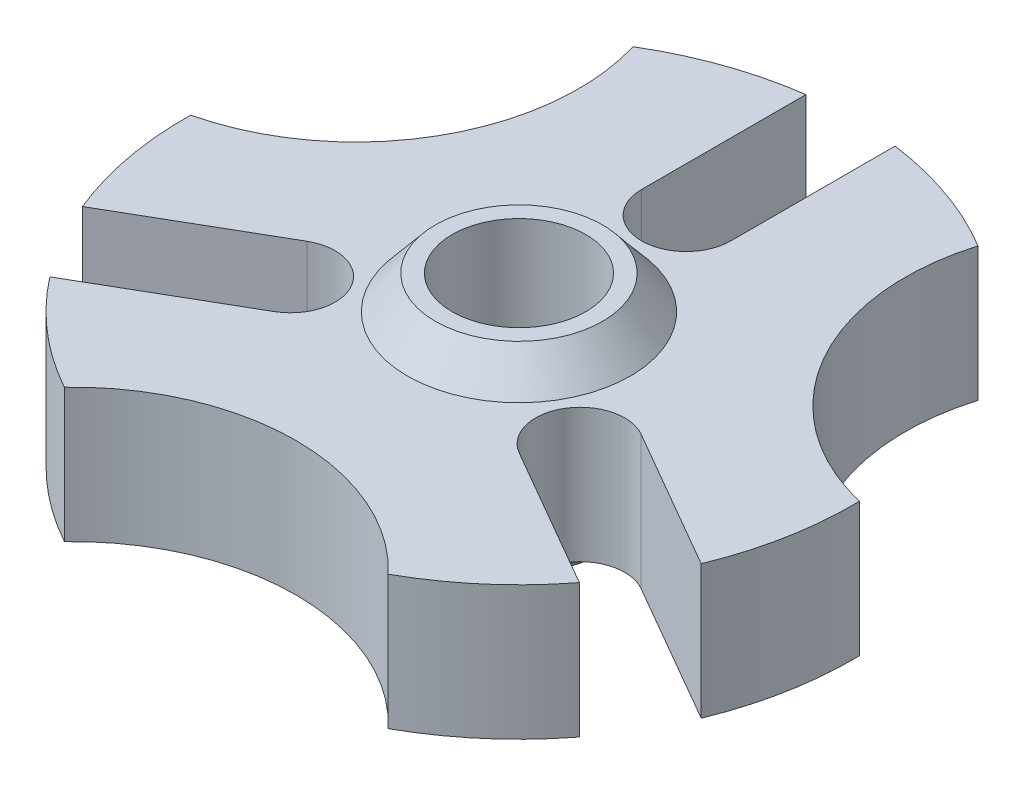
ISO-10303-21;
HEADER;
FILE_DESCRIPTION(('STEP AP214'),'2;1');
FILE_NAME('part.step','',(''),(''),'','','');
FILE_SCHEMA(('AUTOMOTIVE_DESIGN { 1 0 10303 214 1 1 1 1 }'));
ENDSEC;
DATA;
#1=APPLICATION_CONTEXT('core data for automotive mechanical design processes');
#2=APPLICATION_PROTOCOL_DEFINITION('international standard','automotive_design',2000,#1);
#3=PRODUCT_CONTEXT('',#1,'mechanical');
#4=PRODUCT('Part','Part','',(#3));
#5=PRODUCT_RELATED_PRODUCT_CATEGORY('part','',(#4));
#6=PRODUCT_DEFINITION_FORMATION('','',#4);
#7=PRODUCT_DEFINITION_CONTEXT('part definition',#1,'design');
#8=PRODUCT_DEFINITION('design','',#6,#7);
#9=PRODUCT_DEFINITION_SHAPE('','',#8);
#10=(LENGTH_UNIT() NAMED_UNIT(*) SI_UNIT(.MILLI.,.METRE.));
#11=(NAMED_UNIT(*) PLANE_ANGLE_UNIT() SI_UNIT($,.RADIAN.));
#12=(NAMED_UNIT(*) SI_UNIT($,.STERADIAN.) SOLID_ANGLE_UNIT());
#13=UNCERTAINTY_MEASURE_WITH_UNIT(LENGTH_MEASURE(1.E-05),#10,'distance_accuracy_value','');
#14=(GEOMETRIC_REPRESENTATION_CONTEXT(3) GLOBAL_UNCERTAINTY_ASSIGNED_CONTEXT((#13)) GLOBAL_UNIT_ASSIGNED_CONTEXT((#10,
#11,#12)) REPRESENTATION_CONTEXT('',''));
#15=CARTESIAN_POINT('',(0.,0.,0.));
#16=DIRECTION('',(0.,0.,1.));
#17=DIRECTION('',(1.,0.,0.));
#18=AXIS2_PLACEMENT_3D('',#15,#16,#17);
#19=CARTESIAN_POINT('',(0.,6.,0.));
#20=DIRECTION('',(0.,1.,0.));
#21=DIRECTION('',(0.,0.,1.));
#22=AXIS2_PLACEMENT_3D('',#19,#20,#21);
#23=PLANE('',#22);
#24=CARTESIAN_POINT('',(0.,6.,0.));
#25=DIRECTION('',(0.,1.,0.));
#26=DIRECTION('',(0.,0.,1.));
#27=AXIS2_PLACEMENT_3D('',#24,#25,#26);
#28=CIRCLE('',#27,10.);
#29=CARTESIAN_POINT('',(0.,6.,10.));
#30=VERTEX_POINT('',#29);
#31=EDGE_CURVE('E11',#30,#30,#28,.T.);
#32=ORIENTED_EDGE('',*,*,#31,.F.);
#33=EDGE_LOOP('',(#32));
#34=FACE_BOUND('',#33,.T.);
#35=CARTESIAN_POINT('',(0.,6.,0.));
#36=DIRECTION('',(0.,1.,0.));
#37=DIRECTION('',(0.,0.,1.));
#38=AXIS2_PLACEMENT_3D('',#35,#36,#37);
#39=CIRCLE('',#38,30.);
#40=CARTESIAN_POINT('',(-23.7487863791675,6.,18.3301703624562));
#41=VERTEX_POINT('',#40);
#42=CARTESIAN_POINT('',(-14.5236875482778,6.,26.25));
#43=VERTEX_POINT('',#42);
#44=EDGE_CURVE('E254',#41,#43,#39,.T.);
#45=ORIENTED_EDGE('',*,*,#44,.T.);
#46=CARTESIAN_POINT('',(0.,6.,40.));
#47=DIRECTION('',(0.,-1.,0.));
#48=DIRECTION('',(0.,0.,1.));
#49=AXIS2_PLACEMENT_3D('',#46,#47,#48);
#50=CIRCLE('',#49,20.);
#51=CARTESIAN_POINT('',(14.5236875482778,6.,26.25));
#52=VERTEX_POINT('',#51);
#53=EDGE_CURVE('E131',#43,#52,#50,.T.);
#54=ORIENTED_EDGE('',*,*,#53,.T.);
#55=CARTESIAN_POINT('',(0.,6.,0.));
#56=DIRECTION('',(0.,1.,0.));
#57=DIRECTION('',(0.,0.,1.));
#58=AXIS2_PLACEMENT_3D('',#55,#56,#57);
#59=CIRCLE('',#58,30.);
#60=CARTESIAN_POINT('',(23.7487863791671,6.,18.3301703624567));
#61=VERTEX_POINT('',#60);
#62=EDGE_CURVE('E335',#52,#61,#59,.T.);
#63=ORIENTED_EDGE('',*,*,#62,.T.);
#64=DIRECTION('',(-0.866025403784428,0.,-0.500000000000019));
#65=VECTOR('',#64,1.);
#66=CARTESIAN_POINT('',(10.9903810567665,6.,10.9641016151379));
#67=LINE('',#66,#65);
#68=CARTESIAN_POINT('',(10.9903810567665,6.,10.9641016151379));
#69=VERTEX_POINT('',#68);
#70=EDGE_CURVE('E331',#61,#69,#67,.T.);
#71=ORIENTED_EDGE('',*,*,#70,.T.);
#72=CARTESIAN_POINT('',(12.9903810567665,6.,7.50000000000009));
#73=DIRECTION('',(0.,-1.,0.));
#74=DIRECTION('',(0.,0.,1.));
#75=AXIS2_PLACEMENT_3D('',#72,#73,#74);
#76=CIRCLE('',#75,4.);
#77=CARTESIAN_POINT('',(14.9903810567666,6.,4.03589838486237));
#78=VERTEX_POINT('',#77);
#79=EDGE_CURVE('E334',#69,#78,#76,.T.);
#80=ORIENTED_EDGE('',*,*,#79,.T.);
#81=DIRECTION('',(0.866025403784433,0.,0.50000000000001));
#82=VECTOR('',#81,1.);
#83=CARTESIAN_POINT('',(14.9903810567665,6.,4.03589838486241));
#84=LINE('',#83,#82);
#85=CARTESIAN_POINT('',(27.7487863791673,6.,11.4019671321811));
#86=VERTEX_POINT('',#85);
#87=EDGE_CURVE('E339',#78,#86,#84,.T.);
#88=ORIENTED_EDGE('',*,*,#87,.T.);
#89=CARTESIAN_POINT('',(0.,6.,0.));
#90=DIRECTION('',(0.,1.,0.));
#91=DIRECTION('',(0.,0.,1.));
#92=AXIS2_PLACEMENT_3D('',#89,#90,#91);
#93=CIRCLE('',#92,30.);
#94=CARTESIAN_POINT('',(29.9950106234804,6.,-0.547117626563413));
#95=VERTEX_POINT('',#94);
#96=EDGE_CURVE('E346',#86,#95,#93,.T.);
#97=ORIENTED_EDGE('',*,*,#96,.T.);
#98=CARTESIAN_POINT('',(34.6410161513777,6.,-19.9999999999997));
#99=DIRECTION('',(0.,-1.,0.));
#100=DIRECTION('',(0.,0.,1.));
#101=AXIS2_PLACEMENT_3D('',#98,#99,#100);
#102=CIRCLE('',#101,20.);
#103=CARTESIAN_POINT('',(15.4713230752028,6.,-25.7028823734362));
#104=VERTEX_POINT('',#103);
#105=EDGE_CURVE('E349',#95,#104,#102,.T.);
#106=ORIENTED_EDGE('',*,*,#105,.T.);
#107=CARTESIAN_POINT('',(0.,6.,0.));
#108=DIRECTION('',(0.,1.,0.));
#109=DIRECTION('',(0.,0.,1.));
#110=AXIS2_PLACEMENT_3D('',#107,#108,#109);
#111=CIRCLE('',#110,30.);
#112=CARTESIAN_POINT('',(4.0000000000002,6.,-29.732137494637));
#113=VERTEX_POINT('',#112);
#114=EDGE_CURVE('E352',#104,#113,#111,.T.);
#115=ORIENTED_EDGE('',*,*,#114,.T.);
#116=DIRECTION('',(0.,0.,1.));
#117=VECTOR('',#116,1.);
#118=CARTESIAN_POINT('',(4.00000000000011,6.,-15.));
#119=LINE('',#118,#117);
#120=CARTESIAN_POINT('',(4.00000000000011,6.,-15.));
#121=VERTEX_POINT('',#120);
#122=EDGE_CURVE('E355',#113,#121,#119,.T.);
#123=ORIENTED_EDGE('',*,*,#122,.T.);
#124=CARTESIAN_POINT('',(0.,6.,-15.));
#125=DIRECTION('',(0.,-1.,0.));
#126=DIRECTION('',(0.,0.,1.));
#127=AXIS2_PLACEMENT_3D('',#124,#125,#126);
#128=CIRCLE('',#127,4.);
#129=CARTESIAN_POINT('',(-3.99999999999993,6.,-15.));
#130=VERTEX_POINT('',#129);
#131=EDGE_CURVE('E358',#121,#130,#128,.T.);
#132=ORIENTED_EDGE('',*,*,#131,.T.);
#133=DIRECTION('',(0.,0.,-1.));
#134=VECTOR('',#133,1.);
#135=CARTESIAN_POINT('',(-3.9999999999999,6.,-15.));
#136=LINE('',#135,#134);
#137=CARTESIAN_POINT('',(-3.9999999999998,6.,-29.732137494637));
#138=VERTEX_POINT('',#137);
#139=EDGE_CURVE('E361',#130,#138,#136,.T.);
#140=ORIENTED_EDGE('',*,*,#139,.T.);
#141=CARTESIAN_POINT('',(0.,6.,0.));
#142=DIRECTION('',(0.,1.,0.));
#143=DIRECTION('',(0.,0.,1.));
#144=AXIS2_PLACEMENT_3D('',#141,#142,#143);
#145=CIRCLE('',#144,30.);
#146=CARTESIAN_POINT('',(-15.4713230752025,6.,-25.7028823734364));
#147=VERTEX_POINT('',#146);
#148=EDGE_CURVE('E364',#138,#147,#145,.T.);
#149=ORIENTED_EDGE('',*,*,#148,.T.);
#150=CARTESIAN_POINT('',(-34.6410161513775,6.,-20.0000000000002));
#151=DIRECTION('',(0.,-1.,0.));
#152=DIRECTION('',(0.,0.,1.));
#153=AXIS2_PLACEMENT_3D('',#150,#151,#152);
#154=CIRCLE('',#153,20.);
#155=CARTESIAN_POINT('',(-29.9950106234804,6.,-0.547117626563808));
#156=VERTEX_POINT('',#155);
#157=EDGE_CURVE('E367',#147,#156,#154,.T.);
#158=ORIENTED_EDGE('',*,*,#157,.T.);
#159=CARTESIAN_POINT('',(0.,6.,0.));
#160=DIRECTION('',(0.,1.,0.));
#161=DIRECTION('',(0.,0.,1.));
#162=AXIS2_PLACEMENT_3D('',#159,#160,#161);
#163=CIRCLE('',#162,30.);
#164=CARTESIAN_POINT('',(-27.7487863791676,6.,11.4019671321806));
#165=VERTEX_POINT('',#164);
#166=EDGE_CURVE('E179',#156,#165,#163,.T.);
#167=ORIENTED_EDGE('',*,*,#166,.T.);
#168=DIRECTION('',(0.866025403784445,0.,-0.49999999999999));
#169=VECTOR('',#168,1.);
#170=CARTESIAN_POINT('',(-14.9903810567666,6.,4.03589838486221));
#171=LINE('',#170,#169);
#172=CARTESIAN_POINT('',(-14.9903810567666,6.,4.03589838486221));
#173=VERTEX_POINT('',#172);
#174=EDGE_CURVE('E174',#165,#173,#171,.T.);
#175=ORIENTED_EDGE('',*,*,#174,.T.);
#176=CARTESIAN_POINT('',(-12.9903810567667,6.,7.49999999999992));
#177=DIRECTION('',(0.,-1.,0.));
#178=DIRECTION('',(0.,0.,1.));
#179=AXIS2_PLACEMENT_3D('',#176,#177,#178);
#180=CIRCLE('',#179,4.);
#181=CARTESIAN_POINT('',(-10.9903810567666,6.,10.9641016151377));
#182=VERTEX_POINT('',#181);
#183=EDGE_CURVE('E177',#173,#182,#180,.T.);
#184=ORIENTED_EDGE('',*,*,#183,.T.);
#185=DIRECTION('',(-0.86602540378444,0.,0.499999999999998));
#186=VECTOR('',#185,1.);
#187=CARTESIAN_POINT('',(-10.9903810567666,6.,10.9641016151377));
#188=LINE('',#187,#186);
#189=EDGE_CURVE('E57',#182,#41,#188,.T.);
#190=ORIENTED_EDGE('',*,*,#189,.T.);
#191=EDGE_LOOP('',(#45,#54,#63,#71,#80,#88,#97,#106,#115,#123,#132,#140,#149,#158,#167,#175,
#184,#190));
#192=FACE_BOUND('',#191,.T.);
#193=ADVANCED_FACE('F39',(#34,#192),#23,.T.);
#194=CARTESIAN_POINT('',(0.,-6.,0.));
#195=DIRECTION('',(0.,1.,0.));
#196=DIRECTION('',(0.,0.,1.));
#197=AXIS2_PLACEMENT_3D('',#194,#195,#196);
#198=PLANE('',#197);
#199=CARTESIAN_POINT('',(0.,-6.,0.));
#200=DIRECTION('',(0.,1.,0.));
#201=DIRECTION('',(0.,0.,1.));
#202=AXIS2_PLACEMENT_3D('',#199,#200,#201);
#203=CIRCLE('',#202,10.);
#204=CARTESIAN_POINT('',(0.,-6.,10.));
#205=VERTEX_POINT('',#204);
#206=EDGE_CURVE('E650',#205,#205,#203,.T.);
#207=ORIENTED_EDGE('',*,*,#206,.T.);
#208=EDGE_LOOP('',(#207));
#209=FACE_BOUND('',#208,.T.);
#210=CARTESIAN_POINT('',(0.,-6.,0.));
#211=DIRECTION('',(0.,1.,0.));
#212=DIRECTION('',(0.,0.,1.));
#213=AXIS2_PLACEMENT_3D('',#210,#211,#212);
#214=CIRCLE('',#213,30.);
#215=CARTESIAN_POINT('',(-23.7487863791675,-6.,18.3301703624562));
#216=VERTEX_POINT('',#215);
#217=CARTESIAN_POINT('',(-14.5236875482778,-6.,26.25));
#218=VERTEX_POINT('',#217);
#219=EDGE_CURVE('E201',#216,#218,#214,.T.);
#220=ORIENTED_EDGE('',*,*,#219,.F.);
#221=DIRECTION('',(-0.86602540378444,0.,0.499999999999998));
#222=VECTOR('',#221,1.);
#223=CARTESIAN_POINT('',(-10.9903810567666,-6.,10.9641016151377));
#224=LINE('',#223,#222);
#225=CARTESIAN_POINT('',(-10.9903810567666,-6.,10.9641016151377));
#226=VERTEX_POINT('',#225);
#227=EDGE_CURVE('E122',#226,#216,#224,.T.);
#228=ORIENTED_EDGE('',*,*,#227,.F.);
#229=CARTESIAN_POINT('',(-12.9903810567667,-6.,7.49999999999992));
#230=DIRECTION('',(0.,-1.,0.));
#231=DIRECTION('',(0.,0.,1.));
#232=AXIS2_PLACEMENT_3D('',#229,#230,#231);
#233=CIRCLE('',#232,4.);
#234=CARTESIAN_POINT('',(-14.9903810567666,-6.,4.03589838486221));
#235=VERTEX_POINT('',#234);
#236=EDGE_CURVE('E116',#235,#226,#233,.T.);
#237=ORIENTED_EDGE('',*,*,#236,.F.);
#238=DIRECTION('',(0.866025403784445,0.,-0.49999999999999));
#239=VECTOR('',#238,1.);
#240=CARTESIAN_POINT('',(-14.9903810567666,-6.,4.03589838486221));
#241=LINE('',#240,#239);
#242=CARTESIAN_POINT('',(-27.7487863791676,-6.,11.4019671321806));
#243=VERTEX_POINT('',#242);
#244=EDGE_CURVE('E188',#243,#235,#241,.T.);
#245=ORIENTED_EDGE('',*,*,#244,.F.);
#246=CARTESIAN_POINT('',(0.,-6.,0.));
#247=DIRECTION('',(0.,1.,0.));
#248=DIRECTION('',(0.,0.,1.));
#249=AXIS2_PLACEMENT_3D('',#246,#247,#248);
#250=CIRCLE('',#249,30.);
#251=CARTESIAN_POINT('',(-29.9950106234804,-6.,-0.547117626563808));
#252=VERTEX_POINT('',#251);
#253=EDGE_CURVE('E245',#252,#243,#250,.T.);
#254=ORIENTED_EDGE('',*,*,#253,.F.);
#255=CARTESIAN_POINT('',(-34.6410161513775,-6.,-20.0000000000002));
#256=DIRECTION('',(0.,-1.,0.));
#257=DIRECTION('',(0.,0.,1.));
#258=AXIS2_PLACEMENT_3D('',#255,#256,#257);
#259=CIRCLE('',#258,20.);
#260=CARTESIAN_POINT('',(-15.4713230752025,-6.,-25.7028823734364));
#261=VERTEX_POINT('',#260);
#262=EDGE_CURVE('E242',#261,#252,#259,.T.);
#263=ORIENTED_EDGE('',*,*,#262,.F.);
#264=CARTESIAN_POINT('',(0.,-6.,0.));
#265=DIRECTION('',(0.,1.,0.));
#266=DIRECTION('',(0.,0.,1.));
#267=AXIS2_PLACEMENT_3D('',#264,#265,#266);
#268=CIRCLE('',#267,30.);
#269=CARTESIAN_POINT('',(-3.9999999999998,-6.,-29.732137494637));
#270=VERTEX_POINT('',#269);
#271=EDGE_CURVE('E239',#270,#261,#268,.T.);
#272=ORIENTED_EDGE('',*,*,#271,.F.);
#273=DIRECTION('',(0.,0.,-1.));
#274=VECTOR('',#273,1.);
#275=CARTESIAN_POINT('',(-3.9999999999999,-6.,-15.));
#276=LINE('',#275,#274);
#277=CARTESIAN_POINT('',(-3.99999999999993,-6.,-15.));
#278=VERTEX_POINT('',#277);
#279=EDGE_CURVE('E236',#278,#270,#276,.T.);
#280=ORIENTED_EDGE('',*,*,#279,.F.);
#281=CARTESIAN_POINT('',(0.,-6.,-15.));
#282=DIRECTION('',(0.,-1.,0.));
#283=DIRECTION('',(0.,0.,1.));
#284=AXIS2_PLACEMENT_3D('',#281,#282,#283);
#285=CIRCLE('',#284,4.);
#286=CARTESIAN_POINT('',(4.00000000000011,-6.,-15.));
#287=VERTEX_POINT('',#286);
#288=EDGE_CURVE('E233',#287,#278,#285,.T.);
#289=ORIENTED_EDGE('',*,*,#288,.F.);
#290=DIRECTION('',(0.,0.,1.));
#291=VECTOR('',#290,1.);
#292=CARTESIAN_POINT('',(4.00000000000011,-6.,-15.));
#293=LINE('',#292,#291);
#294=CARTESIAN_POINT('',(4.0000000000002,-6.,-29.732137494637));
#295=VERTEX_POINT('',#294);
#296=EDGE_CURVE('E230',#295,#287,#293,.T.);
#297=ORIENTED_EDGE('',*,*,#296,.F.);
#298=CARTESIAN_POINT('',(0.,-6.,0.));
#299=DIRECTION('',(0.,1.,0.));
#300=DIRECTION('',(0.,0.,1.));
#301=AXIS2_PLACEMENT_3D('',#298,#299,#300);
#302=CIRCLE('',#301,30.);
#303=CARTESIAN_POINT('',(15.4713230752028,-6.,-25.7028823734362));
#304=VERTEX_POINT('',#303);
#305=EDGE_CURVE('E227',#304,#295,#302,.T.);
#306=ORIENTED_EDGE('',*,*,#305,.F.);
#307=CARTESIAN_POINT('',(34.6410161513777,-6.,-19.9999999999997));
#308=DIRECTION('',(0.,-1.,0.));
#309=DIRECTION('',(0.,0.,1.));
#310=AXIS2_PLACEMENT_3D('',#307,#308,#309);
#311=CIRCLE('',#310,20.);
#312=CARTESIAN_POINT('',(29.9950106234804,-6.,-0.547117626563413));
#313=VERTEX_POINT('',#312);
#314=EDGE_CURVE('E224',#313,#304,#311,.T.);
#315=ORIENTED_EDGE('',*,*,#314,.F.);
#316=CARTESIAN_POINT('',(0.,-6.,0.));
#317=DIRECTION('',(0.,1.,0.));
#318=DIRECTION('',(0.,0.,1.));
#319=AXIS2_PLACEMENT_3D('',#316,#317,#318);
#320=CIRCLE('',#319,30.);
#321=CARTESIAN_POINT('',(27.7487863791673,-6.,11.4019671321811));
#322=VERTEX_POINT('',#321);
#323=EDGE_CURVE('E221',#322,#313,#320,.T.);
#324=ORIENTED_EDGE('',*,*,#323,.F.);
#325=DIRECTION('',(0.866025403784433,0.,0.50000000000001));
#326=VECTOR('',#325,1.);
#327=CARTESIAN_POINT('',(14.9903810567665,-6.,4.03589838486241));
#328=LINE('',#327,#326);
#329=CARTESIAN_POINT('',(14.9903810567666,-6.,4.03589838486237));
#330=VERTEX_POINT('',#329);
#331=EDGE_CURVE('E218',#330,#322,#328,.T.);
#332=ORIENTED_EDGE('',*,*,#331,.F.);
#333=CARTESIAN_POINT('',(12.9903810567665,-6.,7.50000000000009));
#334=DIRECTION('',(0.,-1.,0.));
#335=DIRECTION('',(0.,0.,1.));
#336=AXIS2_PLACEMENT_3D('',#333,#334,#335);
#337=CIRCLE('',#336,4.);
#338=CARTESIAN_POINT('',(10.9903810567665,-6.,10.9641016151379));
#339=VERTEX_POINT('',#338);
#340=EDGE_CURVE('E215',#339,#330,#337,.T.);
#341=ORIENTED_EDGE('',*,*,#340,.F.);
#342=DIRECTION('',(-0.866025403784428,0.,-0.500000000000019));
#343=VECTOR('',#342,1.);
#344=CARTESIAN_POINT('',(10.9903810567665,-6.,10.9641016151379));
#345=LINE('',#344,#343);
#346=CARTESIAN_POINT('',(23.7487863791671,-6.,18.3301703624567));
#347=VERTEX_POINT('',#346);
#348=EDGE_CURVE('E212',#347,#339,#345,.T.);
#349=ORIENTED_EDGE('',*,*,#348,.F.);
#350=CARTESIAN_POINT('',(0.,-6.,0.));
#351=DIRECTION('',(0.,1.,0.));
#352=DIRECTION('',(0.,0.,1.));
#353=AXIS2_PLACEMENT_3D('',#350,#351,#352);
#354=CIRCLE('',#353,30.);
#355=CARTESIAN_POINT('',(14.5236875482778,-6.,26.25));
#356=VERTEX_POINT('',#355);
#357=EDGE_CURVE('E209',#356,#347,#354,.T.);
#358=ORIENTED_EDGE('',*,*,#357,.F.);
#359=CARTESIAN_POINT('',(0.,-6.,40.));
#360=DIRECTION('',(0.,-1.,0.));
#361=DIRECTION('',(0.,0.,1.));
#362=AXIS2_PLACEMENT_3D('',#359,#360,#361);
#363=CIRCLE('',#362,20.);
#364=EDGE_CURVE('E205',#218,#356,#363,.T.);
#365=ORIENTED_EDGE('',*,*,#364,.F.);
#366=EDGE_LOOP('',(#220,#228,#237,#245,#254,#263,#272,#280,#289,#297,#306,#315,#324,#332,#341,
#349,#358,#365));
#367=FACE_BOUND('',#366,.T.);
#368=ADVANCED_FACE('F319',(#209,#367),#198,.F.);
#369=CARTESIAN_POINT('',(0.,6.,0.));
#370=DIRECTION('',(0.,-1.,0.));
#371=DIRECTION('',(0.,0.,-1.));
#372=AXIS2_PLACEMENT_3D('',#369,#370,#371);
#373=CYLINDRICAL_SURFACE('',#372,30.);
#374=ORIENTED_EDGE('',*,*,#219,.T.);
#375=DIRECTION('',(0.,-1.,0.));
#376=VECTOR('',#375,1.);
#377=CARTESIAN_POINT('',(-14.5236875482778,6.,26.25));
#378=LINE('',#377,#376);
#379=EDGE_CURVE('E49',#43,#218,#378,.T.);
#380=ORIENTED_EDGE('',*,*,#379,.F.);
#381=ORIENTED_EDGE('',*,*,#44,.F.);
#382=DIRECTION('',(0.,-1.,0.));
#383=VECTOR('',#382,1.);
#384=CARTESIAN_POINT('',(-23.7487863791675,6.,18.3301703624562));
#385=LINE('',#384,#383);
#386=EDGE_CURVE('E197',#41,#216,#385,.T.);
#387=ORIENTED_EDGE('',*,*,#386,.T.);
#388=EDGE_LOOP('',(#374,#380,#381,#387));
#389=FACE_BOUND('',#388,.T.);
#390=ADVANCED_FACE('F41',(#389),#373,.T.);
#391=CARTESIAN_POINT('',(0.,6.,40.));
#392=DIRECTION('',(0.,-1.,0.));
#393=DIRECTION('',(0.,0.,-1.));
#394=AXIS2_PLACEMENT_3D('',#391,#392,#393);
#395=CYLINDRICAL_SURFACE('',#394,20.);
#396=ORIENTED_EDGE('',*,*,#364,.T.);
#397=DIRECTION('',(0.,-1.,0.));
#398=VECTOR('',#397,1.);
#399=CARTESIAN_POINT('',(14.5236875482778,6.,26.25));
#400=LINE('',#399,#398);
#401=EDGE_CURVE('E309',#52,#356,#400,.T.);
#402=ORIENTED_EDGE('',*,*,#401,.F.);
#403=ORIENTED_EDGE('',*,*,#53,.F.);
#404=ORIENTED_EDGE('',*,*,#379,.T.);
#405=EDGE_LOOP('',(#396,#402,#403,#404));
#406=FACE_BOUND('',#405,.T.);
#407=ADVANCED_FACE('F314',(#406),#395,.F.);
#408=CARTESIAN_POINT('',(0.,6.,0.));
#409=DIRECTION('',(0.,-1.,0.));
#410=DIRECTION('',(0.,0.,-1.));
#411=AXIS2_PLACEMENT_3D('',#408,#409,#410);
#412=CYLINDRICAL_SURFACE('',#411,30.);
#413=ORIENTED_EDGE('',*,*,#357,.T.);
#414=DIRECTION('',(0.,-1.,0.));
#415=VECTOR('',#414,1.);
#416=CARTESIAN_POINT('',(23.7487863791671,6.,18.3301703624567));
#417=LINE('',#416,#415);
#418=EDGE_CURVE('E305',#61,#347,#417,.T.);
#419=ORIENTED_EDGE('',*,*,#418,.F.);
#420=ORIENTED_EDGE('',*,*,#62,.F.);
#421=ORIENTED_EDGE('',*,*,#401,.T.);
#422=EDGE_LOOP('',(#413,#419,#420,#421));
#423=FACE_BOUND('',#422,.T.);
#424=ADVANCED_FACE('F325',(#423),#412,.T.);
#425=CARTESIAN_POINT('',(10.9903810567665,6.,10.9641016151379));
#426=DIRECTION('',(-0.500000000000019,0.,0.866025403784428));
#427=DIRECTION('',(0.866025403784428,0.,0.500000000000019));
#428=AXIS2_PLACEMENT_3D('',#425,#426,#427);
#429=PLANE('',#428);
#430=ORIENTED_EDGE('',*,*,#348,.T.);
#431=DIRECTION('',(0.,-1.,0.));
#432=VECTOR('',#431,1.);
#433=CARTESIAN_POINT('',(10.9903810567665,6.,10.9641016151379));
#434=LINE('',#433,#432);
#435=EDGE_CURVE('E301',#69,#339,#434,.T.);
#436=ORIENTED_EDGE('',*,*,#435,.F.);
#437=ORIENTED_EDGE('',*,*,#70,.F.);
#438=ORIENTED_EDGE('',*,*,#418,.T.);
#439=EDGE_LOOP('',(#430,#436,#437,#438));
#440=FACE_BOUND('',#439,.T.);
#441=ADVANCED_FACE('F329',(#440),#429,.F.);
#442=CARTESIAN_POINT('',(12.9903810567665,6.,7.50000000000009));
#443=DIRECTION('',(0.,-1.,0.));
#444=DIRECTION('',(0.,0.,-1.));
#445=AXIS2_PLACEMENT_3D('',#442,#443,#444);
#446=CYLINDRICAL_SURFACE('',#445,4.);
#447=ORIENTED_EDGE('',*,*,#340,.T.);
#448=DIRECTION('',(0.,-1.,0.));
#449=VECTOR('',#448,1.);
#450=CARTESIAN_POINT('',(14.9903810567666,6.,4.03589838486237));
#451=LINE('',#450,#449);
#452=EDGE_CURVE('E297',#78,#330,#451,.T.);
#453=ORIENTED_EDGE('',*,*,#452,.F.);
#454=ORIENTED_EDGE('',*,*,#79,.F.);
#455=ORIENTED_EDGE('',*,*,#435,.T.);
#456=EDGE_LOOP('',(#447,#453,#454,#455));
#457=FACE_BOUND('',#456,.T.);
#458=ADVANCED_FACE('F420',(#457),#446,.F.);
#459=CARTESIAN_POINT('',(14.9903810567665,6.,4.03589838486241));
#460=DIRECTION('',(0.50000000000001,0.,-0.866025403784433));
#461=DIRECTION('',(-0.866025403784433,0.,-0.50000000000001));
#462=AXIS2_PLACEMENT_3D('',#459,#460,#461);
#463=PLANE('',#462);
#464=ORIENTED_EDGE('',*,*,#331,.T.);
#465=DIRECTION('',(0.,-1.,0.));
#466=VECTOR('',#465,1.);
#467=CARTESIAN_POINT('',(27.7487863791673,6.,11.4019671321811));
#468=LINE('',#467,#466);
#469=EDGE_CURVE('E293',#86,#322,#468,.T.);
#470=ORIENTED_EDGE('',*,*,#469,.F.);
#471=ORIENTED_EDGE('',*,*,#87,.F.);
#472=ORIENTED_EDGE('',*,*,#452,.T.);
#473=EDGE_LOOP('',(#464,#470,#471,#472));
#474=FACE_BOUND('',#473,.T.);
#475=ADVANCED_FACE('F417',(#474),#463,.F.);
#476=CARTESIAN_POINT('',(0.,6.,0.));
#477=DIRECTION('',(0.,-1.,0.));
#478=DIRECTION('',(0.,0.,-1.));
#479=AXIS2_PLACEMENT_3D('',#476,#477,#478);
#480=CYLINDRICAL_SURFACE('',#479,30.);
#481=ORIENTED_EDGE('',*,*,#323,.T.);
#482=DIRECTION('',(0.,-1.,0.));
#483=VECTOR('',#482,1.);
#484=CARTESIAN_POINT('',(29.9950106234804,6.,-0.547117626563413));
#485=LINE('',#484,#483);
#486=EDGE_CURVE('E289',#95,#313,#485,.T.);
#487=ORIENTED_EDGE('',*,*,#486,.F.);
#488=ORIENTED_EDGE('',*,*,#96,.F.);
#489=ORIENTED_EDGE('',*,*,#469,.T.);
#490=EDGE_LOOP('',(#481,#487,#488,#489));
#491=FACE_BOUND('',#490,.T.);
#492=ADVANCED_FACE('F412',(#491),#480,.T.);
#493=CARTESIAN_POINT('',(34.6410161513777,6.,-19.9999999999997));
#494=DIRECTION('',(0.,-1.,0.));
#495=DIRECTION('',(0.,0.,-1.));
#496=AXIS2_PLACEMENT_3D('',#493,#494,#495);
#497=CYLINDRICAL_SURFACE('',#496,20.);
#498=ORIENTED_EDGE('',*,*,#314,.T.);
#499=DIRECTION('',(0.,-1.,0.));
#500=VECTOR('',#499,1.);
#501=CARTESIAN_POINT('',(15.4713230752028,6.,-25.7028823734362));
#502=LINE('',#501,#500);
#503=EDGE_CURVE('E285',#104,#304,#502,.T.);
#504=ORIENTED_EDGE('',*,*,#503,.F.);
#505=ORIENTED_EDGE('',*,*,#105,.F.);
#506=ORIENTED_EDGE('',*,*,#486,.T.);
#507=EDGE_LOOP('',(#498,#504,#505,#506));
#508=FACE_BOUND('',#507,.T.);
#509=ADVANCED_FACE('F407',(#508),#497,.F.);
#510=CARTESIAN_POINT('',(0.,6.,0.));
#511=DIRECTION('',(0.,-1.,0.));
#512=DIRECTION('',(0.,0.,-1.));
#513=AXIS2_PLACEMENT_3D('',#510,#511,#512);
#514=CYLINDRICAL_SURFACE('',#513,30.);
#515=ORIENTED_EDGE('',*,*,#305,.T.);
#516=DIRECTION('',(0.,-1.,0.));
#517=VECTOR('',#516,1.);
#518=CARTESIAN_POINT('',(4.0000000000002,6.,-29.732137494637));
#519=LINE('',#518,#517);
#520=EDGE_CURVE('E281',#113,#295,#519,.T.);
#521=ORIENTED_EDGE('',*,*,#520,.F.);
#522=ORIENTED_EDGE('',*,*,#114,.F.);
#523=ORIENTED_EDGE('',*,*,#503,.T.);
#524=EDGE_LOOP('',(#515,#521,#522,#523));
#525=FACE_BOUND('',#524,.T.);
#526=ADVANCED_FACE('F403',(#525),#514,.T.);
#527=CARTESIAN_POINT('',(4.00000000000011,6.,-15.));
#528=DIRECTION('',(1.,0.,0.));
#529=DIRECTION('',(0.,0.,-1.));
#530=AXIS2_PLACEMENT_3D('',#527,#528,#529);
#531=PLANE('',#530);
#532=ORIENTED_EDGE('',*,*,#296,.T.);
#533=DIRECTION('',(0.,-1.,0.));
#534=VECTOR('',#533,1.);
#535=CARTESIAN_POINT('',(4.00000000000011,6.,-15.));
#536=LINE('',#535,#534);
#537=EDGE_CURVE('E277',#121,#287,#536,.T.);
#538=ORIENTED_EDGE('',*,*,#537,.F.);
#539=ORIENTED_EDGE('',*,*,#122,.F.);
#540=ORIENTED_EDGE('',*,*,#520,.T.);
#541=EDGE_LOOP('',(#532,#538,#539,#540));
#542=FACE_BOUND('',#541,.T.);
#543=ADVANCED_FACE('F398',(#542),#531,.F.);
#544=CARTESIAN_POINT('',(0.,6.,-15.));
#545=DIRECTION('',(0.,-1.,0.));
#546=DIRECTION('',(0.,0.,-1.));
#547=AXIS2_PLACEMENT_3D('',#544,#545,#546);
#548=CYLINDRICAL_SURFACE('',#547,4.);
#549=ORIENTED_EDGE('',*,*,#288,.T.);
#550=DIRECTION('',(0.,-1.,0.));
#551=VECTOR('',#550,1.);
#552=CARTESIAN_POINT('',(-3.99999999999993,6.,-15.));
#553=LINE('',#552,#551);
#554=EDGE_CURVE('E273',#130,#278,#553,.T.);
#555=ORIENTED_EDGE('',*,*,#554,.F.);
#556=ORIENTED_EDGE('',*,*,#131,.F.);
#557=ORIENTED_EDGE('',*,*,#537,.T.);
#558=EDGE_LOOP('',(#549,#555,#556,#557));
#559=FACE_BOUND('',#558,.T.);
#560=ADVANCED_FACE('F392',(#559),#548,.F.);
#561=CARTESIAN_POINT('',(-3.9999999999999,6.,-15.));
#562=DIRECTION('',(-1.,0.,0.));
#563=DIRECTION('',(0.,0.,1.));
#564=AXIS2_PLACEMENT_3D('',#561,#562,#563);
#565=PLANE('',#564);
#566=ORIENTED_EDGE('',*,*,#279,.T.);
#567=DIRECTION('',(0.,-1.,0.));
#568=VECTOR('',#567,1.);
#569=CARTESIAN_POINT('',(-3.9999999999998,6.,-29.732137494637));
#570=LINE('',#569,#568);
#571=EDGE_CURVE('E269',#138,#270,#570,.T.);
#572=ORIENTED_EDGE('',*,*,#571,.F.);
#573=ORIENTED_EDGE('',*,*,#139,.F.);
#574=ORIENTED_EDGE('',*,*,#554,.T.);
#575=EDGE_LOOP('',(#566,#572,#573,#574));
#576=FACE_BOUND('',#575,.T.);
#577=ADVANCED_FACE('F388',(#576),#565,.F.);
#578=CARTESIAN_POINT('',(0.,6.,0.));
#579=DIRECTION('',(0.,-1.,0.));
#580=DIRECTION('',(0.,0.,-1.));
#581=AXIS2_PLACEMENT_3D('',#578,#579,#580);
#582=CYLINDRICAL_SURFACE('',#581,30.);
#583=ORIENTED_EDGE('',*,*,#271,.T.);
#584=DIRECTION('',(0.,-1.,0.));
#585=VECTOR('',#584,1.);
#586=CARTESIAN_POINT('',(-15.4713230752025,6.,-25.7028823734364));
#587=LINE('',#586,#585);
#588=EDGE_CURVE('E265',#147,#261,#587,.T.);
#589=ORIENTED_EDGE('',*,*,#588,.F.);
#590=ORIENTED_EDGE('',*,*,#148,.F.);
#591=ORIENTED_EDGE('',*,*,#571,.T.);
#592=EDGE_LOOP('',(#583,#589,#590,#591));
#593=FACE_BOUND('',#592,.T.);
#594=ADVANCED_FACE('F384',(#593),#582,.T.);
#595=CARTESIAN_POINT('',(-34.6410161513775,6.,-20.0000000000002));
#596=DIRECTION('',(0.,-1.,0.));
#597=DIRECTION('',(0.,0.,-1.));
#598=AXIS2_PLACEMENT_3D('',#595,#596,#597);
#599=CYLINDRICAL_SURFACE('',#598,20.);
#600=ORIENTED_EDGE('',*,*,#262,.T.);
#601=DIRECTION('',(0.,-1.,0.));
#602=VECTOR('',#601,1.);
#603=CARTESIAN_POINT('',(-29.9950106234804,6.,-0.547117626563808));
#604=LINE('',#603,#602);
#605=EDGE_CURVE('E261',#156,#252,#604,.T.);
#606=ORIENTED_EDGE('',*,*,#605,.F.);
#607=ORIENTED_EDGE('',*,*,#157,.F.);
#608=ORIENTED_EDGE('',*,*,#588,.T.);
#609=EDGE_LOOP('',(#600,#606,#607,#608));
#610=FACE_BOUND('',#609,.T.);
#611=ADVANCED_FACE('F375',(#610),#599,.F.);
#612=CARTESIAN_POINT('',(0.,6.,0.));
#613=DIRECTION('',(0.,-1.,0.));
#614=DIRECTION('',(0.,0.,-1.));
#615=AXIS2_PLACEMENT_3D('',#612,#613,#614);
#616=CYLINDRICAL_SURFACE('',#615,30.);
#617=ORIENTED_EDGE('',*,*,#253,.T.);
#618=DIRECTION('',(0.,-1.,0.));
#619=VECTOR('',#618,1.);
#620=CARTESIAN_POINT('',(-27.7487863791676,6.,11.4019671321806));
#621=LINE('',#620,#619);
#622=EDGE_CURVE('E190',#165,#243,#621,.T.);
#623=ORIENTED_EDGE('',*,*,#622,.F.);
#624=ORIENTED_EDGE('',*,*,#166,.F.);
#625=ORIENTED_EDGE('',*,*,#605,.T.);
#626=EDGE_LOOP('',(#617,#623,#624,#625));
#627=FACE_BOUND('',#626,.T.);
#628=ADVANCED_FACE('F379',(#627),#616,.T.);
#629=CARTESIAN_POINT('',(-14.9903810567666,6.,4.03589838486221));
#630=DIRECTION('',(-0.49999999999999,0.,-0.866025403784444));
#631=DIRECTION('',(-0.866025403784445,0.,0.49999999999999));
#632=AXIS2_PLACEMENT_3D('',#629,#630,#631);
#633=PLANE('',#632);
#634=ORIENTED_EDGE('',*,*,#244,.T.);
#635=DIRECTION('',(0.,-1.,0.));
#636=VECTOR('',#635,1.);
#637=CARTESIAN_POINT('',(-14.9903810567666,6.,4.03589838486221));
#638=LINE('',#637,#636);
#639=EDGE_CURVE('E185',#173,#235,#638,.T.);
#640=ORIENTED_EDGE('',*,*,#639,.F.);
#641=ORIENTED_EDGE('',*,*,#174,.F.);
#642=ORIENTED_EDGE('',*,*,#622,.T.);
#643=EDGE_LOOP('',(#634,#640,#641,#642));
#644=FACE_BOUND('',#643,.T.);
#645=ADVANCED_FACE('F186',(#644),#633,.F.);
#646=CARTESIAN_POINT('',(-12.9903810567667,6.,7.49999999999992));
#647=DIRECTION('',(0.,-1.,0.));
#648=DIRECTION('',(0.,0.,-1.));
#649=AXIS2_PLACEMENT_3D('',#646,#647,#648);
#650=CYLINDRICAL_SURFACE('',#649,4.);
#651=ORIENTED_EDGE('',*,*,#236,.T.);
#652=DIRECTION('',(0.,-1.,0.));
#653=VECTOR('',#652,1.);
#654=CARTESIAN_POINT('',(-10.9903810567666,6.,10.9641016151377));
#655=LINE('',#654,#653);
#656=EDGE_CURVE('E191',#182,#226,#655,.T.);
#657=ORIENTED_EDGE('',*,*,#656,.F.);
#658=ORIENTED_EDGE('',*,*,#183,.F.);
#659=ORIENTED_EDGE('',*,*,#639,.T.);
#660=EDGE_LOOP('',(#651,#657,#658,#659));
#661=FACE_BOUND('',#660,.T.);
#662=ADVANCED_FACE('F193',(#661),#650,.F.);
#663=CARTESIAN_POINT('',(-10.9903810567666,6.,10.9641016151377));
#664=DIRECTION('',(0.499999999999998,0.,0.86602540378444));
#665=DIRECTION('',(0.86602540378444,0.,-0.499999999999998));
#666=AXIS2_PLACEMENT_3D('',#663,#664,#665);
#667=PLANE('',#666);
#668=ORIENTED_EDGE('',*,*,#227,.T.);
#669=ORIENTED_EDGE('',*,*,#386,.F.);
#670=ORIENTED_EDGE('',*,*,#189,.F.);
#671=ORIENTED_EDGE('',*,*,#656,.T.);
#672=EDGE_LOOP('',(#668,#669,#670,#671));
#673=FACE_BOUND('',#672,.T.);
#674=ADVANCED_FACE('F442',(#673),#667,.F.);
#675=CARTESIAN_POINT('',(0.,6.,0.));
#676=DIRECTION('',(0.,-1.,0.));
#677=DIRECTION('',(0.,0.,-1.));
#678=AXIS2_PLACEMENT_3D('',#675,#676,#677);
#679=CYLINDRICAL_SURFACE('',#678,6.);
#680=CARTESIAN_POINT('',(0.,9.,0.));
#681=DIRECTION('',(0.,1.,0.));
#682=DIRECTION('',(0.,0.,1.));
#683=AXIS2_PLACEMENT_3D('',#680,#681,#682);
#684=CIRCLE('',#683,6.);
#685=CARTESIAN_POINT('',(0.,9.,6.));
#686=VERTEX_POINT('',#685);
#687=EDGE_CURVE('E656',#686,#686,#684,.T.);
#688=ORIENTED_EDGE('',*,*,#687,.T.);
#689=EDGE_LOOP('',(#688));
#690=FACE_BOUND('',#689,.T.);
#691=CARTESIAN_POINT('',(0.,-9.,0.));
#692=DIRECTION('',(0.,1.,0.));
#693=DIRECTION('',(0.,0.,1.));
#694=AXIS2_PLACEMENT_3D('',#691,#692,#693);
#695=CIRCLE('',#694,6.);
#696=CARTESIAN_POINT('',(0.,-9.,6.));
#697=VERTEX_POINT('',#696);
#698=EDGE_CURVE('E645',#697,#697,#695,.T.);
#699=ORIENTED_EDGE('',*,*,#698,.F.);
#700=EDGE_LOOP('',(#699));
#701=FACE_BOUND('',#700,.T.);
#702=ADVANCED_FACE('F439',(#690,#701),#679,.F.);
#703=CARTESIAN_POINT('',(0.,9.,0.));
#704=DIRECTION('',(0.,-1.,0.));
#705=DIRECTION('',(0.,0.,-1.));
#706=AXIS2_PLACEMENT_3D('',#703,#704,#705);
#707=CONICAL_SURFACE('',#706,7.5,0.694738276196703);
#708=ORIENTED_EDGE('',*,*,#31,.T.);
#709=EDGE_LOOP('',(#708));
#710=FACE_BOUND('',#709,.T.);
#711=CARTESIAN_POINT('',(0.,9.,0.));
#712=DIRECTION('',(0.,1.,0.));
#713=DIRECTION('',(0.,0.,1.));
#714=AXIS2_PLACEMENT_3D('',#711,#712,#713);
#715=CIRCLE('',#714,7.5);
#716=CARTESIAN_POINT('',(0.,9.,7.5));
#717=VERTEX_POINT('',#716);
#718=EDGE_CURVE('E206',#717,#717,#715,.T.);
#719=ORIENTED_EDGE('',*,*,#718,.F.);
#720=EDGE_LOOP('',(#719));
#721=FACE_BOUND('',#720,.T.);
#722=ADVANCED_FACE('F520',(#710,#721),#707,.T.);
#723=CARTESIAN_POINT('',(0.,9.,7.5));
#724=DIRECTION('',(0.,1.,0.));
#725=DIRECTION('',(0.,0.,1.));
#726=AXIS2_PLACEMENT_3D('',#723,#724,#725);
#727=PLANE('',#726);
#728=ORIENTED_EDGE('',*,*,#718,.T.);
#729=EDGE_LOOP('',(#728));
#730=FACE_BOUND('',#729,.T.);
#731=ORIENTED_EDGE('',*,*,#687,.F.);
#732=EDGE_LOOP('',(#731));
#733=FACE_BOUND('',#732,.T.);
#734=ADVANCED_FACE('F529',(#730,#733),#727,.T.);
#735=CARTESIAN_POINT('',(0.,-9.,0.));
#736=DIRECTION('',(0.,1.,0.));
#737=DIRECTION('',(0.,0.,-1.));
#738=AXIS2_PLACEMENT_3D('',#735,#736,#737);
#739=CONICAL_SURFACE('',#738,7.5,0.694738276196703);
#740=ORIENTED_EDGE('',*,*,#206,.F.);
#741=EDGE_LOOP('',(#740));
#742=FACE_BOUND('',#741,.T.);
#743=CARTESIAN_POINT('',(0.,-9.,0.));
#744=DIRECTION('',(0.,1.,0.));
#745=DIRECTION('',(0.,0.,1.));
#746=AXIS2_PLACEMENT_3D('',#743,#744,#745);
#747=CIRCLE('',#746,7.5);
#748=CARTESIAN_POINT('',(0.,-9.,7.5));
#749=VERTEX_POINT('',#748);
#750=EDGE_CURVE('E642',#749,#749,#747,.T.);
#751=ORIENTED_EDGE('',*,*,#750,.T.);
#752=EDGE_LOOP('',(#751));
#753=FACE_BOUND('',#752,.T.);
#754=ADVANCED_FACE('F536',(#742,#753),#739,.T.);
#755=CARTESIAN_POINT('',(0.,-9.,7.5));
#756=DIRECTION('',(0.,-1.,0.));
#757=DIRECTION('',(0.,0.,1.));
#758=AXIS2_PLACEMENT_3D('',#755,#756,#757);
#759=PLANE('',#758);
#760=ORIENTED_EDGE('',*,*,#750,.F.);
#761=EDGE_LOOP('',(#760));
#762=FACE_BOUND('',#761,.T.);
#763=ORIENTED_EDGE('',*,*,#698,.T.);
#764=EDGE_LOOP('',(#763));
#765=FACE_BOUND('',#764,.T.);
#766=ADVANCED_FACE('F543',(#762,#765),#759,.T.);
#767=CLOSED_SHELL('',(#193,#368,#390,#407,#424,#441,#458,#475,#492,#509,#526,#543,#560,#577,
#594,#611,#628,#645,#662,#674,#702,#722,#734,#754,#766));
#768=MANIFOLD_SOLID_BREP('B2',#767);
#769=ADVANCED_BREP_SHAPE_REPRESENTATION('',(#18,#768),#14);
#770=SHAPE_DEFINITION_REPRESENTATION(#9,#769);
ENDSEC;
END-ISO-10303-21;
